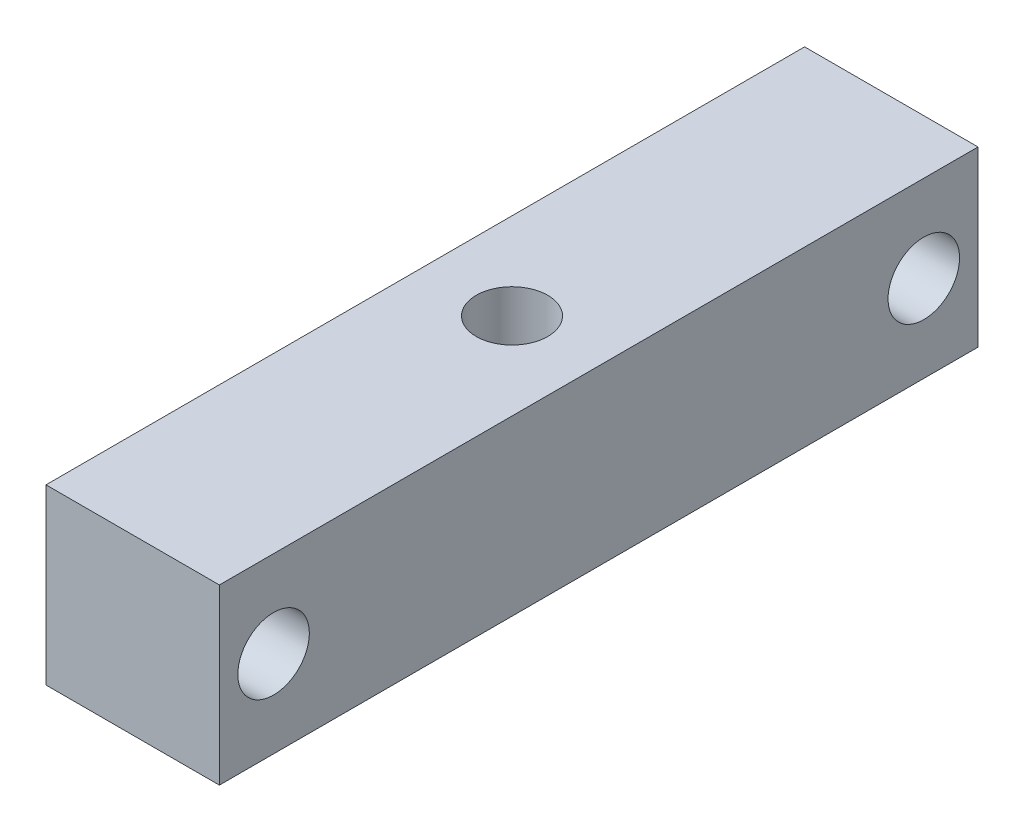
ISO-10303-21;
HEADER;
FILE_DESCRIPTION(('STEP AP214'),'2;1');
FILE_NAME('part.step','',(''),(''),'','','');
FILE_SCHEMA(('AUTOMOTIVE_DESIGN { 1 0 10303 214 1 1 1 1 }'));
ENDSEC;
DATA;
#1=APPLICATION_CONTEXT('core data for automotive mechanical design processes');
#2=APPLICATION_PROTOCOL_DEFINITION('international standard','automotive_design',2000,#1);
#3=PRODUCT_CONTEXT('',#1,'mechanical');
#4=PRODUCT('Part','Part','',(#3));
#5=PRODUCT_RELATED_PRODUCT_CATEGORY('part','',(#4));
#6=PRODUCT_DEFINITION_FORMATION('','',#4);
#7=PRODUCT_DEFINITION_CONTEXT('part definition',#1,'design');
#8=PRODUCT_DEFINITION('design','',#6,#7);
#9=PRODUCT_DEFINITION_SHAPE('','',#8);
#10=(LENGTH_UNIT() NAMED_UNIT(*) SI_UNIT(.MILLI.,.METRE.));
#11=(NAMED_UNIT(*) PLANE_ANGLE_UNIT() SI_UNIT($,.RADIAN.));
#12=(NAMED_UNIT(*) SI_UNIT($,.STERADIAN.) SOLID_ANGLE_UNIT());
#13=UNCERTAINTY_MEASURE_WITH_UNIT(LENGTH_MEASURE(1.E-05),#10,'distance_accuracy_value','');
#14=(GEOMETRIC_REPRESENTATION_CONTEXT(3) GLOBAL_UNCERTAINTY_ASSIGNED_CONTEXT((#13)) GLOBAL_UNIT_ASSIGNED_CONTEXT((#10,
#11,#12)) REPRESENTATION_CONTEXT('',''));
#15=CARTESIAN_POINT('',(0.,0.,0.));
#16=DIRECTION('',(0.,0.,1.));
#17=DIRECTION('',(1.,0.,0.));
#18=AXIS2_PLACEMENT_3D('',#15,#16,#17);
#19=CARTESIAN_POINT('',(0.,0.,35.));
#20=DIRECTION('',(1.,0.,0.));
#21=DIRECTION('',(0.,0.,-1.));
#22=AXIS2_PLACEMENT_3D('',#19,#20,#21);
#23=PLANE('',#22);
#24=CARTESIAN_POINT('',(0.,4.,32.5));
#25=DIRECTION('',(1.,0.,0.));
#26=DIRECTION('',(0.,0.,-1.));
#27=AXIS2_PLACEMENT_3D('',#24,#25,#26);
#28=CIRCLE('',#27,1.65);
#29=CARTESIAN_POINT('',(0.,4.,30.85));
#30=VERTEX_POINT('',#29);
#31=EDGE_CURVE('E102',#30,#30,#28,.T.);
#32=ORIENTED_EDGE('',*,*,#31,.T.);
#33=EDGE_LOOP('',(#32));
#34=FACE_BOUND('',#33,.T.);
#35=CARTESIAN_POINT('',(0.,4.,2.5));
#36=DIRECTION('',(1.,0.,0.));
#37=DIRECTION('',(0.,0.,-1.));
#38=AXIS2_PLACEMENT_3D('',#35,#36,#37);
#39=CIRCLE('',#38,1.65);
#40=CARTESIAN_POINT('',(0.,4.,0.850000000000002));
#41=VERTEX_POINT('',#40);
#42=EDGE_CURVE('E115',#41,#41,#39,.T.);
#43=ORIENTED_EDGE('',*,*,#42,.T.);
#44=EDGE_LOOP('',(#43));
#45=FACE_BOUND('',#44,.T.);
#46=DIRECTION('',(0.,-1.,0.));
#47=VECTOR('',#46,1.);
#48=CARTESIAN_POINT('',(0.,0.,0.));
#49=LINE('',#48,#47);
#50=CARTESIAN_POINT('',(0.,8.,0.));
#51=VERTEX_POINT('',#50);
#52=CARTESIAN_POINT('',(0.,0.,0.));
#53=VERTEX_POINT('',#52);
#54=EDGE_CURVE('E99',#51,#53,#49,.T.);
#55=ORIENTED_EDGE('',*,*,#54,.T.);
#56=DIRECTION('',(0.,0.,-1.));
#57=VECTOR('',#56,1.);
#58=CARTESIAN_POINT('',(0.,0.,35.));
#59=LINE('',#58,#57);
#60=CARTESIAN_POINT('',(0.,0.,35.));
#61=VERTEX_POINT('',#60);
#62=EDGE_CURVE('E11',#61,#53,#59,.T.);
#63=ORIENTED_EDGE('',*,*,#62,.F.);
#64=DIRECTION('',(0.,-1.,0.));
#65=VECTOR('',#64,1.);
#66=CARTESIAN_POINT('',(0.,0.,35.));
#67=LINE('',#66,#65);
#68=CARTESIAN_POINT('',(0.,8.,35.));
#69=VERTEX_POINT('',#68);
#70=EDGE_CURVE('E87',#69,#61,#67,.T.);
#71=ORIENTED_EDGE('',*,*,#70,.F.);
#72=DIRECTION('',(0.,0.,-1.));
#73=VECTOR('',#72,1.);
#74=CARTESIAN_POINT('',(0.,8.,35.));
#75=LINE('',#74,#73);
#76=EDGE_CURVE('E95',#69,#51,#75,.T.);
#77=ORIENTED_EDGE('',*,*,#76,.T.);
#78=EDGE_LOOP('',(#55,#63,#71,#77));
#79=FACE_BOUND('',#78,.T.);
#80=ADVANCED_FACE('F36',(#34,#45,#79),#23,.F.);
#81=CARTESIAN_POINT('',(0.,0.,35.));
#82=DIRECTION('',(0.,1.,0.));
#83=DIRECTION('',(0.,0.,1.));
#84=AXIS2_PLACEMENT_3D('',#81,#82,#83);
#85=PLANE('',#84);
#86=CARTESIAN_POINT('',(4.,0.,17.5));
#87=DIRECTION('',(0.,1.,0.));
#88=DIRECTION('',(0.,0.,1.));
#89=AXIS2_PLACEMENT_3D('',#86,#87,#88);
#90=CIRCLE('',#89,1.65);
#91=CARTESIAN_POINT('',(4.,0.,19.15));
#92=VERTEX_POINT('',#91);
#93=EDGE_CURVE('E122',#92,#92,#90,.T.);
#94=ORIENTED_EDGE('',*,*,#93,.T.);
#95=EDGE_LOOP('',(#94));
#96=FACE_BOUND('',#95,.T.);
#97=DIRECTION('',(1.,0.,0.));
#98=VECTOR('',#97,1.);
#99=CARTESIAN_POINT('',(0.,0.,0.));
#100=LINE('',#99,#98);
#101=CARTESIAN_POINT('',(8.,0.,0.));
#102=VERTEX_POINT('',#101);
#103=EDGE_CURVE('E91',#53,#102,#100,.T.);
#104=ORIENTED_EDGE('',*,*,#103,.T.);
#105=DIRECTION('',(0.,0.,-1.));
#106=VECTOR('',#105,1.);
#107=CARTESIAN_POINT('',(8.,0.,35.));
#108=LINE('',#107,#106);
#109=CARTESIAN_POINT('',(8.,0.,35.));
#110=VERTEX_POINT('',#109);
#111=EDGE_CURVE('E44',#110,#102,#108,.T.);
#112=ORIENTED_EDGE('',*,*,#111,.F.);
#113=DIRECTION('',(1.,0.,0.));
#114=VECTOR('',#113,1.);
#115=CARTESIAN_POINT('',(0.,0.,35.));
#116=LINE('',#115,#114);
#117=EDGE_CURVE('E82',#61,#110,#116,.T.);
#118=ORIENTED_EDGE('',*,*,#117,.F.);
#119=ORIENTED_EDGE('',*,*,#62,.T.);
#120=EDGE_LOOP('',(#104,#112,#118,#119));
#121=FACE_BOUND('',#120,.T.);
#122=ADVANCED_FACE('F90',(#96,#121),#85,.F.);
#123=CARTESIAN_POINT('',(8.,0.,35.));
#124=DIRECTION('',(-1.,0.,0.));
#125=DIRECTION('',(0.,-1.,0.));
#126=AXIS2_PLACEMENT_3D('',#123,#124,#125);
#127=PLANE('',#126);
#128=CARTESIAN_POINT('',(8.,4.,32.5));
#129=DIRECTION('',(1.,0.,0.));
#130=DIRECTION('',(0.,1.,0.));
#131=AXIS2_PLACEMENT_3D('',#128,#129,#130);
#132=CIRCLE('',#131,1.65);
#133=CARTESIAN_POINT('',(8.,5.65,32.5));
#134=VERTEX_POINT('',#133);
#135=EDGE_CURVE('E118',#134,#134,#132,.T.);
#136=ORIENTED_EDGE('',*,*,#135,.F.);
#137=EDGE_LOOP('',(#136));
#138=FACE_BOUND('',#137,.T.);
#139=CARTESIAN_POINT('',(8.,4.,2.5));
#140=DIRECTION('',(1.,0.,0.));
#141=DIRECTION('',(0.,1.,0.));
#142=AXIS2_PLACEMENT_3D('',#139,#140,#141);
#143=CIRCLE('',#142,1.65);
#144=CARTESIAN_POINT('',(8.,5.65,2.5));
#145=VERTEX_POINT('',#144);
#146=EDGE_CURVE('E119',#145,#145,#143,.T.);
#147=ORIENTED_EDGE('',*,*,#146,.F.);
#148=EDGE_LOOP('',(#147));
#149=FACE_BOUND('',#148,.T.);
#150=DIRECTION('',(0.,1.,0.));
#151=VECTOR('',#150,1.);
#152=CARTESIAN_POINT('',(8.,0.,0.));
#153=LINE('',#152,#151);
#154=CARTESIAN_POINT('',(8.,8.,0.));
#155=VERTEX_POINT('',#154);
#156=EDGE_CURVE('E69',#102,#155,#153,.T.);
#157=ORIENTED_EDGE('',*,*,#156,.T.);
#158=DIRECTION('',(0.,0.,-1.));
#159=VECTOR('',#158,1.);
#160=CARTESIAN_POINT('',(8.,8.,35.));
#161=LINE('',#160,#159);
#162=CARTESIAN_POINT('',(8.,8.,35.));
#163=VERTEX_POINT('',#162);
#164=EDGE_CURVE('E92',#163,#155,#161,.T.);
#165=ORIENTED_EDGE('',*,*,#164,.F.);
#166=DIRECTION('',(0.,1.,0.));
#167=VECTOR('',#166,1.);
#168=CARTESIAN_POINT('',(8.,0.,35.));
#169=LINE('',#168,#167);
#170=EDGE_CURVE('E85',#110,#163,#169,.T.);
#171=ORIENTED_EDGE('',*,*,#170,.F.);
#172=ORIENTED_EDGE('',*,*,#111,.T.);
#173=EDGE_LOOP('',(#157,#165,#171,#172));
#174=FACE_BOUND('',#173,.T.);
#175=ADVANCED_FACE('F93',(#138,#149,#174),#127,.F.);
#176=CARTESIAN_POINT('',(0.,8.,35.));
#177=DIRECTION('',(0.,-1.,0.));
#178=DIRECTION('',(0.,0.,-1.));
#179=AXIS2_PLACEMENT_3D('',#176,#177,#178);
#180=PLANE('',#179);
#181=CARTESIAN_POINT('',(4.,8.,17.5));
#182=DIRECTION('',(0.,1.,0.));
#183=DIRECTION('',(0.,0.,1.));
#184=AXIS2_PLACEMENT_3D('',#181,#182,#183);
#185=CIRCLE('',#184,1.65);
#186=CARTESIAN_POINT('',(4.,8.,19.15));
#187=VERTEX_POINT('',#186);
#188=EDGE_CURVE('E127',#187,#187,#185,.T.);
#189=ORIENTED_EDGE('',*,*,#188,.F.);
#190=EDGE_LOOP('',(#189));
#191=FACE_BOUND('',#190,.T.);
#192=DIRECTION('',(-1.,0.,0.));
#193=VECTOR('',#192,1.);
#194=CARTESIAN_POINT('',(0.,8.,0.));
#195=LINE('',#194,#193);
#196=EDGE_CURVE('E75',#155,#51,#195,.T.);
#197=ORIENTED_EDGE('',*,*,#196,.T.);
#198=ORIENTED_EDGE('',*,*,#76,.F.);
#199=DIRECTION('',(-1.,0.,0.));
#200=VECTOR('',#199,1.);
#201=CARTESIAN_POINT('',(0.,8.,35.));
#202=LINE('',#201,#200);
#203=EDGE_CURVE('E52',#163,#69,#202,.T.);
#204=ORIENTED_EDGE('',*,*,#203,.F.);
#205=ORIENTED_EDGE('',*,*,#164,.T.);
#206=EDGE_LOOP('',(#197,#198,#204,#205));
#207=FACE_BOUND('',#206,.T.);
#208=ADVANCED_FACE('F107',(#191,#207),#180,.F.);
#209=CARTESIAN_POINT('',(0.,0.,35.));
#210=DIRECTION('',(0.,0.,-1.));
#211=DIRECTION('',(-1.,0.,0.));
#212=AXIS2_PLACEMENT_3D('',#209,#210,#211);
#213=PLANE('',#212);
#214=ORIENTED_EDGE('',*,*,#70,.T.);
#215=ORIENTED_EDGE('',*,*,#117,.T.);
#216=ORIENTED_EDGE('',*,*,#170,.T.);
#217=ORIENTED_EDGE('',*,*,#203,.T.);
#218=EDGE_LOOP('',(#214,#215,#216,#217));
#219=FACE_BOUND('',#218,.T.);
#220=ADVANCED_FACE('F83',(#219),#213,.F.);
#221=CARTESIAN_POINT('',(0.,0.,0.));
#222=DIRECTION('',(0.,0.,-1.));
#223=DIRECTION('',(-1.,0.,0.));
#224=AXIS2_PLACEMENT_3D('',#221,#222,#223);
#225=PLANE('',#224);
#226=ORIENTED_EDGE('',*,*,#54,.F.);
#227=ORIENTED_EDGE('',*,*,#196,.F.);
#228=ORIENTED_EDGE('',*,*,#156,.F.);
#229=ORIENTED_EDGE('',*,*,#103,.F.);
#230=EDGE_LOOP('',(#226,#227,#228,#229));
#231=FACE_BOUND('',#230,.T.);
#232=ADVANCED_FACE('F110',(#231),#225,.T.);
#233=CARTESIAN_POINT('',(-32.,3.99999999999999,2.5));
#234=DIRECTION('',(1.,0.,0.));
#235=DIRECTION('',(0.,1.,0.));
#236=AXIS2_PLACEMENT_3D('',#233,#234,#235);
#237=CYLINDRICAL_SURFACE('',#236,1.65);
#238=ORIENTED_EDGE('',*,*,#146,.T.);
#239=EDGE_LOOP('',(#238));
#240=FACE_BOUND('',#239,.T.);
#241=ORIENTED_EDGE('',*,*,#42,.F.);
#242=EDGE_LOOP('',(#241));
#243=FACE_BOUND('',#242,.T.);
#244=ADVANCED_FACE('F154',(#240,#243),#237,.F.);
#245=CARTESIAN_POINT('',(-32.,3.99999999999999,32.5));
#246=DIRECTION('',(1.,0.,0.));
#247=DIRECTION('',(0.,1.,0.));
#248=AXIS2_PLACEMENT_3D('',#245,#246,#247);
#249=CYLINDRICAL_SURFACE('',#248,1.65);
#250=ORIENTED_EDGE('',*,*,#135,.T.);
#251=EDGE_LOOP('',(#250));
#252=FACE_BOUND('',#251,.T.);
#253=ORIENTED_EDGE('',*,*,#31,.F.);
#254=EDGE_LOOP('',(#253));
#255=FACE_BOUND('',#254,.T.);
#256=ADVANCED_FACE('F156',(#252,#255),#249,.F.);
#257=CARTESIAN_POINT('',(4.,-32.,17.5));
#258=DIRECTION('',(0.,1.,0.));
#259=DIRECTION('',(0.,0.,1.));
#260=AXIS2_PLACEMENT_3D('',#257,#258,#259);
#261=CYLINDRICAL_SURFACE('',#260,1.65);
#262=ORIENTED_EDGE('',*,*,#188,.T.);
#263=EDGE_LOOP('',(#262));
#264=FACE_BOUND('',#263,.T.);
#265=ORIENTED_EDGE('',*,*,#93,.F.);
#266=EDGE_LOOP('',(#265));
#267=FACE_BOUND('',#266,.T.);
#268=ADVANCED_FACE('F131',(#264,#267),#261,.F.);
#269=CLOSED_SHELL('',(#80,#122,#175,#208,#220,#232,#244,#256,#268));
#270=MANIFOLD_SOLID_BREP('B2',#269);
#271=ADVANCED_BREP_SHAPE_REPRESENTATION('',(#18,#270),#14);
#272=SHAPE_DEFINITION_REPRESENTATION(#9,#271);
ENDSEC;
END-ISO-10303-21;
